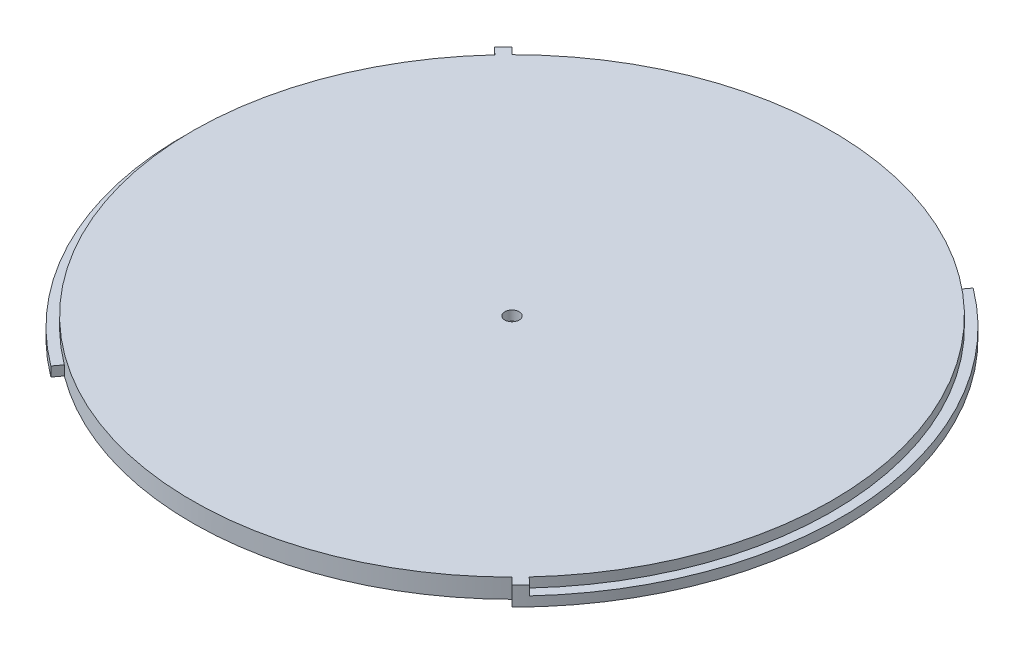
ISO-10303-21;
HEADER;
FILE_DESCRIPTION(('STEP AP214'),'2;1');
FILE_NAME('part.step','',(''),(''),'','','');
FILE_SCHEMA(('AUTOMOTIVE_DESIGN { 1 0 10303 214 1 1 1 1 }'));
ENDSEC;
DATA;
#1=APPLICATION_CONTEXT('core data for automotive mechanical design processes');
#2=APPLICATION_PROTOCOL_DEFINITION('international standard','automotive_design',2000,#1);
#3=PRODUCT_CONTEXT('',#1,'mechanical');
#4=PRODUCT('Part','Part','',(#3));
#5=PRODUCT_RELATED_PRODUCT_CATEGORY('part','',(#4));
#6=PRODUCT_DEFINITION_FORMATION('','',#4);
#7=PRODUCT_DEFINITION_CONTEXT('part definition',#1,'design');
#8=PRODUCT_DEFINITION('design','',#6,#7);
#9=PRODUCT_DEFINITION_SHAPE('','',#8);
#10=(LENGTH_UNIT() NAMED_UNIT(*) SI_UNIT(.MILLI.,.METRE.));
#11=(NAMED_UNIT(*) PLANE_ANGLE_UNIT() SI_UNIT($,.RADIAN.));
#12=(NAMED_UNIT(*) SI_UNIT($,.STERADIAN.) SOLID_ANGLE_UNIT());
#13=UNCERTAINTY_MEASURE_WITH_UNIT(LENGTH_MEASURE(1.E-05),#10,'distance_accuracy_value','');
#14=(GEOMETRIC_REPRESENTATION_CONTEXT(3) GLOBAL_UNCERTAINTY_ASSIGNED_CONTEXT((#13)) GLOBAL_UNIT_ASSIGNED_CONTEXT((#10,
#11,#12)) REPRESENTATION_CONTEXT('',''));
#15=CARTESIAN_POINT('',(0.,0.,0.));
#16=DIRECTION('',(0.,0.,1.));
#17=DIRECTION('',(1.,0.,0.));
#18=AXIS2_PLACEMENT_3D('',#15,#16,#17);
#19=CARTESIAN_POINT('',(-66.53,-2.00000000000001,0.));
#20=DIRECTION('',(0.,1.,0.));
#21=DIRECTION('',(-1.,0.,0.));
#22=AXIS2_PLACEMENT_3D('',#19,#20,#21);
#23=PLANE('',#22);
#24=CARTESIAN_POINT('',(0.,-2.,0.));
#25=DIRECTION('',(0.,1.,0.));
#26=DIRECTION('',(-1.,0.,0.));
#27=AXIS2_PLACEMENT_3D('',#24,#25,#26);
#28=CIRCLE('',#27,68.53);
#29=CARTESIAN_POINT('',(50.259047868636,-1.99999999999999,46.5874340068022));
#30=VERTEX_POINT('',#29);
#31=CARTESIAN_POINT('',(40.9241392063636,-2.,-54.9688614600865));
#32=VERTEX_POINT('',#31);
#33=EDGE_CURVE('E160',#30,#32,#28,.T.);
#34=ORIENTED_EDGE('',*,*,#33,.T.);
#35=DIRECTION('',(-0.597171154331879,0.,0.802113840071303));
#36=VECTOR('',#35,1.);
#37=CARTESIAN_POINT('',(-23.7254886747707,-2.,31.8678199548669));
#38=LINE('',#37,#36);
#39=CARTESIAN_POINT('',(39.7297968976998,-2.,-53.3646337799439));
#40=VERTEX_POINT('',#39);
#41=EDGE_CURVE('E153',#32,#40,#38,.T.);
#42=ORIENTED_EDGE('',*,*,#41,.T.);
#43=CARTESIAN_POINT('',(0.,-2.,0.));
#44=DIRECTION('',(0.,1.,0.));
#45=DIRECTION('',(-1.,0.,0.));
#46=AXIS2_PLACEMENT_3D('',#43,#44,#45);
#47=CIRCLE('',#46,66.53);
#48=CARTESIAN_POINT('',(48.7922727958608,-1.99999999999999,45.2278124102228));
#49=VERTEX_POINT('',#48);
#50=EDGE_CURVE('E203',#49,#40,#47,.T.);
#51=ORIENTED_EDGE('',*,*,#50,.F.);
#52=DIRECTION('',(-0.733387536387591,0.,-0.679810798289744));
#53=VECTOR('',#52,1.);
#54=CARTESIAN_POINT('',(48.7922727958609,-1.99999999999999,45.2278124102228));
#55=LINE('',#54,#53);
#56=EDGE_CURVE('E55',#30,#49,#55,.T.);
#57=ORIENTED_EDGE('',*,*,#56,.F.);
#58=EDGE_LOOP('',(#34,#42,#51,#57));
#59=FACE_BOUND('',#58,.T.);
#60=ADVANCED_FACE('F40',(#59),#23,.T.);
#61=CARTESIAN_POINT('',(0.,0.,0.));
#62=DIRECTION('',(0.,1.,0.));
#63=DIRECTION('',(-1.,0.,0.));
#64=AXIS2_PLACEMENT_3D('',#61,#62,#63);
#65=CYLINDRICAL_SURFACE('',#64,68.53);
#66=CARTESIAN_POINT('',(0.,-4.,0.));
#67=DIRECTION('',(0.,1.,0.));
#68=DIRECTION('',(-1.,0.,0.));
#69=AXIS2_PLACEMENT_3D('',#66,#67,#68);
#70=CIRCLE('',#69,68.53);
#71=CARTESIAN_POINT('',(48.4580277147147,-4.00000000000001,48.4580277146921));
#72=VERTEX_POINT('',#71);
#73=CARTESIAN_POINT('',(40.9241392063636,-4.,-54.9688614600865));
#74=VERTEX_POINT('',#73);
#75=EDGE_CURVE('E159',#72,#74,#70,.T.);
#76=ORIENTED_EDGE('',*,*,#75,.T.);
#77=DIRECTION('',(0.,1.,0.));
#78=VECTOR('',#77,1.);
#79=CARTESIAN_POINT('',(40.9241392063636,-9.99999999999999,-54.9688614600865));
#80=LINE('',#79,#78);
#81=EDGE_CURVE('E263',#74,#32,#80,.T.);
#82=ORIENTED_EDGE('',*,*,#81,.T.);
#83=ORIENTED_EDGE('',*,*,#33,.F.);
#84=DIRECTION('',(0.,1.,0.));
#85=VECTOR('',#84,1.);
#86=CARTESIAN_POINT('',(50.259047868636,-6.55763302205952,46.5874340068022));
#87=LINE('',#86,#85);
#88=CARTESIAN_POINT('',(50.259047868636,0.,46.5874340068022));
#89=VERTEX_POINT('',#88);
#90=EDGE_CURVE('E254',#30,#89,#87,.T.);
#91=ORIENTED_EDGE('',*,*,#90,.T.);
#92=CARTESIAN_POINT('',(0.,0.,0.));
#93=DIRECTION('',(0.,1.,0.));
#94=DIRECTION('',(-1.,0.,0.));
#95=AXIS2_PLACEMENT_3D('',#92,#93,#94);
#96=CIRCLE('',#95,68.53);
#97=CARTESIAN_POINT('',(48.4580277147254,0.,48.4580277147028));
#98=VERTEX_POINT('',#97);
#99=EDGE_CURVE('E248',#98,#89,#96,.T.);
#100=ORIENTED_EDGE('',*,*,#99,.F.);
#101=DIRECTION('',(0.,1.,0.));
#102=VECTOR('',#101,1.);
#103=CARTESIAN_POINT('',(48.4580277147147,-9.99999999999999,48.4580277146921));
#104=LINE('',#103,#102);
#105=EDGE_CURVE('E227',#72,#98,#104,.T.);
#106=ORIENTED_EDGE('',*,*,#105,.F.);
#107=EDGE_LOOP('',(#76,#82,#83,#91,#100,#106));
#108=FACE_BOUND('',#107,.T.);
#109=ADVANCED_FACE('F178',(#108),#65,.T.);
#110=CARTESIAN_POINT('',(-66.53,-4.00000000000001,0.));
#111=DIRECTION('',(0.,-1.,0.));
#112=DIRECTION('',(1.,0.,0.));
#113=AXIS2_PLACEMENT_3D('',#110,#111,#112);
#114=PLANE('',#113);
#115=DIRECTION('',(0.597171154331878,0.,-0.802113840071304));
#116=VECTOR('',#115,1.);
#117=CARTESIAN_POINT('',(-23.7254886747704,-4.,31.867819954867));
#118=LINE('',#117,#116);
#119=CARTESIAN_POINT('',(-40.9241392063636,-4.00000000000001,54.9688614600865));
#120=VERTEX_POINT('',#119);
#121=CARTESIAN_POINT('',(-39.7297968976998,-3.99999999999999,53.3646337799438));
#122=VERTEX_POINT('',#121);
#123=EDGE_CURVE('E134',#120,#122,#118,.T.);
#124=ORIENTED_EDGE('',*,*,#123,.F.);
#125=CARTESIAN_POINT('',(-48.4580277147143,-4.00000000000001,-48.4580277147139));
#126=VERTEX_POINT('',#125);
#127=EDGE_CURVE('E150',#126,#120,#70,.T.);
#128=ORIENTED_EDGE('',*,*,#127,.F.);
#129=DIRECTION('',(0.707106781186544,0.,0.707106781186551));
#130=VECTOR('',#129,1.);
#131=CARTESIAN_POINT('',(-33.2650000000002,-4.,-33.2649999999995));
#132=LINE('',#131,#130);
#133=CARTESIAN_POINT('',(-47.0438141523413,-4.00000000000001,-47.0438141523408));
#134=VERTEX_POINT('',#133);
#135=EDGE_CURVE('E219',#126,#134,#132,.T.);
#136=ORIENTED_EDGE('',*,*,#135,.T.);
#137=CARTESIAN_POINT('',(0.,-4.,0.));
#138=DIRECTION('',(0.,-1.,0.));
#139=DIRECTION('',(1.,0.,0.));
#140=AXIS2_PLACEMENT_3D('',#137,#138,#139);
#141=CIRCLE('',#140,66.53);
#142=CARTESIAN_POINT('',(39.7297968976998,-3.99999999999999,-53.3646337799439));
#143=VERTEX_POINT('',#142);
#144=EDGE_CURVE('E217',#134,#143,#141,.T.);
#145=ORIENTED_EDGE('',*,*,#144,.T.);
#146=DIRECTION('',(0.597171154331879,0.,-0.802113840071303));
#147=VECTOR('',#146,1.);
#148=CARTESIAN_POINT('',(-23.7254886747707,-4.,31.8678199548669));
#149=LINE('',#148,#147);
#150=EDGE_CURVE('E259',#143,#74,#149,.T.);
#151=ORIENTED_EDGE('',*,*,#150,.T.);
#152=ORIENTED_EDGE('',*,*,#75,.F.);
#153=DIRECTION('',(-0.707106781186712,0.,-0.707106781186383));
#154=VECTOR('',#153,1.);
#155=CARTESIAN_POINT('',(-33.2650000000155,-4.,-33.265));
#156=LINE('',#155,#154);
#157=CARTESIAN_POINT('',(47.043814152352,-3.99999999999999,47.0438141523301));
#158=VERTEX_POINT('',#157);
#159=EDGE_CURVE('E215',#72,#158,#156,.T.);
#160=ORIENTED_EDGE('',*,*,#159,.T.);
#161=CARTESIAN_POINT('',(0.,-4.,0.));
#162=DIRECTION('',(0.,-1.,0.));
#163=DIRECTION('',(1.,0.,0.));
#164=AXIS2_PLACEMENT_3D('',#161,#162,#163);
#165=CIRCLE('',#164,66.53);
#166=EDGE_CURVE('E152',#158,#122,#165,.T.);
#167=ORIENTED_EDGE('',*,*,#166,.T.);
#168=EDGE_LOOP('',(#124,#128,#136,#145,#151,#152,#160,#167));
#169=FACE_BOUND('',#168,.T.);
#170=CARTESIAN_POINT('',(0.,-4.,0.));
#171=DIRECTION('',(0.,1.,0.));
#172=DIRECTION('',(-1.,0.,0.));
#173=AXIS2_PLACEMENT_3D('',#170,#171,#172);
#174=CIRCLE('',#173,64.53);
#175=CARTESIAN_POINT('',(-64.53,-4.00000000000001,0.));
#176=VERTEX_POINT('',#175);
#177=EDGE_CURVE('E48',#176,#176,#174,.T.);
#178=ORIENTED_EDGE('',*,*,#177,.T.);
#179=EDGE_LOOP('',(#178));
#180=FACE_BOUND('',#179,.T.);
#181=ADVANCED_FACE('F147',(#169,#180),#114,.T.);
#182=CARTESIAN_POINT('',(0.,0.,0.));
#183=DIRECTION('',(0.,1.,0.));
#184=DIRECTION('',(-1.,0.,0.));
#185=AXIS2_PLACEMENT_3D('',#182,#183,#184);
#186=CYLINDRICAL_SURFACE('',#185,66.53);
#187=ORIENTED_EDGE('',*,*,#50,.T.);
#188=DIRECTION('',(0.,1.,0.));
#189=VECTOR('',#188,1.);
#190=CARTESIAN_POINT('',(39.7297968976998,-9.99999999999999,-53.3646337799439));
#191=LINE('',#190,#189);
#192=EDGE_CURVE('E143',#143,#40,#191,.T.);
#193=ORIENTED_EDGE('',*,*,#192,.F.);
#194=ORIENTED_EDGE('',*,*,#144,.F.);
#195=DIRECTION('',(0.,1.,0.));
#196=VECTOR('',#195,1.);
#197=CARTESIAN_POINT('',(-47.0438141523413,-10.,-47.0438141523408));
#198=LINE('',#197,#196);
#199=CARTESIAN_POINT('',(-47.0438141523411,0.,-47.0438141523409));
#200=VERTEX_POINT('',#199);
#201=EDGE_CURVE('E222',#134,#200,#198,.T.);
#202=ORIENTED_EDGE('',*,*,#201,.T.);
#203=CARTESIAN_POINT('',(0.,0.,0.));
#204=DIRECTION('',(0.,1.,0.));
#205=DIRECTION('',(-1.,0.,0.));
#206=AXIS2_PLACEMENT_3D('',#203,#204,#205);
#207=CIRCLE('',#206,66.53);
#208=CARTESIAN_POINT('',(48.7922727958664,0.,45.2278124102167));
#209=VERTEX_POINT('',#208);
#210=EDGE_CURVE('E205',#209,#200,#207,.T.);
#211=ORIENTED_EDGE('',*,*,#210,.F.);
#212=DIRECTION('',(0.,1.,0.));
#213=VECTOR('',#212,1.);
#214=CARTESIAN_POINT('',(48.7922727958608,-6.55763302205952,45.2278124102228));
#215=LINE('',#214,#213);
#216=EDGE_CURVE('E63',#49,#209,#215,.T.);
#217=ORIENTED_EDGE('',*,*,#216,.F.);
#218=EDGE_LOOP('',(#187,#193,#194,#202,#211,#217));
#219=FACE_BOUND('',#218,.T.);
#220=ADVANCED_FACE('F190',(#219),#186,.T.);
#221=DIRECTION('',(-0.597171154331878,0.,0.802113840071304));
#222=VECTOR('',#221,1.);
#223=CARTESIAN_POINT('',(-23.7254886747704,-2.,31.867819954867));
#224=LINE('',#223,#222);
#225=CARTESIAN_POINT('',(-39.7297968976998,-2.00000000000001,53.3646337799438));
#226=VERTEX_POINT('',#225);
#227=CARTESIAN_POINT('',(-40.9241392063636,-2.00000000000001,54.9688614600865));
#228=VERTEX_POINT('',#227);
#229=EDGE_CURVE('E137',#226,#228,#224,.T.);
#230=ORIENTED_EDGE('',*,*,#229,.F.);
#231=CARTESIAN_POINT('',(-48.7922727958609,-2.00000000000001,-45.2278124102227));
#232=VERTEX_POINT('',#231);
#233=EDGE_CURVE('E197',#232,#226,#47,.T.);
#234=ORIENTED_EDGE('',*,*,#233,.F.);
#235=DIRECTION('',(0.733387536387508,0.,0.679810798289834));
#236=VECTOR('',#235,1.);
#237=CARTESIAN_POINT('',(0.,-2.,0.));
#238=LINE('',#237,#236);
#239=CARTESIAN_POINT('',(-50.259047868636,-2.00000000000001,-46.5874340068023));
#240=VERTEX_POINT('',#239);
#241=EDGE_CURVE('E225',#240,#232,#238,.T.);
#242=ORIENTED_EDGE('',*,*,#241,.F.);
#243=EDGE_CURVE('E163',#240,#228,#28,.T.);
#244=ORIENTED_EDGE('',*,*,#243,.T.);
#245=EDGE_LOOP('',(#230,#234,#242,#244));
#246=FACE_BOUND('',#245,.T.);
#247=ADVANCED_FACE('F179',(#246),#23,.T.);
#248=CARTESIAN_POINT('',(0.,-2.,0.));
#249=DIRECTION('',(0.,-1.,0.));
#250=DIRECTION('',(1.,0.,0.));
#251=AXIS2_PLACEMENT_3D('',#248,#249,#250);
#252=PLANE('',#251);
#253=CARTESIAN_POINT('',(0.,-2.,0.));
#254=DIRECTION('',(0.,-1.,0.));
#255=DIRECTION('',(0.,0.,-1.));
#256=AXIS2_PLACEMENT_3D('',#253,#254,#255);
#257=CIRCLE('',#256,1.5);
#258=CARTESIAN_POINT('',(0.,-2.,-1.5));
#259=VERTEX_POINT('',#258);
#260=EDGE_CURVE('E211',#259,#259,#257,.T.);
#261=ORIENTED_EDGE('',*,*,#260,.F.);
#262=EDGE_LOOP('',(#261));
#263=FACE_BOUND('',#262,.T.);
#264=CARTESIAN_POINT('',(0.,-2.,0.));
#265=DIRECTION('',(0.,1.,0.));
#266=DIRECTION('',(-1.,0.,0.));
#267=AXIS2_PLACEMENT_3D('',#264,#265,#266);
#268=CIRCLE('',#267,64.53);
#269=CARTESIAN_POINT('',(-64.53,-2.00000000000001,0.));
#270=VERTEX_POINT('',#269);
#271=EDGE_CURVE('E12',#270,#270,#268,.T.);
#272=ORIENTED_EDGE('',*,*,#271,.F.);
#273=EDGE_LOOP('',(#272));
#274=FACE_BOUND('',#273,.T.);
#275=ADVANCED_FACE('F42',(#263,#274),#252,.T.);
#276=CARTESIAN_POINT('',(0.,0.,0.));
#277=DIRECTION('',(0.,1.,0.));
#278=DIRECTION('',(-1.,0.,0.));
#279=AXIS2_PLACEMENT_3D('',#276,#277,#278);
#280=CYLINDRICAL_SURFACE('',#279,64.53);
#281=ORIENTED_EDGE('',*,*,#271,.T.);
#282=EDGE_LOOP('',(#281));
#283=FACE_BOUND('',#282,.T.);
#284=ORIENTED_EDGE('',*,*,#177,.F.);
#285=EDGE_LOOP('',(#284));
#286=FACE_BOUND('',#285,.T.);
#287=ADVANCED_FACE('F169',(#283,#286),#280,.F.);
#288=DIRECTION('',(0.,1.,0.));
#289=VECTOR('',#288,1.);
#290=CARTESIAN_POINT('',(-40.9241392063636,-10.,54.9688614600865));
#291=LINE('',#290,#289);
#292=EDGE_CURVE('E131',#120,#228,#291,.T.);
#293=ORIENTED_EDGE('',*,*,#292,.T.);
#294=ORIENTED_EDGE('',*,*,#243,.F.);
#295=DIRECTION('',(0.,1.,0.));
#296=VECTOR('',#295,1.);
#297=CARTESIAN_POINT('',(-50.2590478686358,-6.55763302205953,-46.5874340068022));
#298=LINE('',#297,#296);
#299=CARTESIAN_POINT('',(-50.2590478686358,0.,-46.5874340068022));
#300=VERTEX_POINT('',#299);
#301=EDGE_CURVE('E231',#240,#300,#298,.T.);
#302=ORIENTED_EDGE('',*,*,#301,.T.);
#303=CARTESIAN_POINT('',(0.,0.,0.));
#304=DIRECTION('',(0.,1.,0.));
#305=DIRECTION('',(-1.,0.,0.));
#306=AXIS2_PLACEMENT_3D('',#303,#304,#305);
#307=CIRCLE('',#306,68.53);
#308=CARTESIAN_POINT('',(-48.4580277147141,0.,-48.4580277147139));
#309=VERTEX_POINT('',#308);
#310=EDGE_CURVE('E237',#309,#300,#307,.T.);
#311=ORIENTED_EDGE('',*,*,#310,.F.);
#312=DIRECTION('',(0.,1.,0.));
#313=VECTOR('',#312,1.);
#314=CARTESIAN_POINT('',(-48.4580277147143,-10.,-48.4580277147139));
#315=LINE('',#314,#313);
#316=EDGE_CURVE('E158',#126,#309,#315,.T.);
#317=ORIENTED_EDGE('',*,*,#316,.F.);
#318=ORIENTED_EDGE('',*,*,#127,.T.);
#319=EDGE_LOOP('',(#293,#294,#302,#311,#317,#318));
#320=FACE_BOUND('',#319,.T.);
#321=ADVANCED_FACE('F156',(#320),#65,.T.);
#322=ORIENTED_EDGE('',*,*,#233,.T.);
#323=DIRECTION('',(0.,1.,0.));
#324=VECTOR('',#323,1.);
#325=CARTESIAN_POINT('',(-39.7297968976998,-10.,53.3646337799438));
#326=LINE('',#325,#324);
#327=EDGE_CURVE('E142',#122,#226,#326,.T.);
#328=ORIENTED_EDGE('',*,*,#327,.F.);
#329=ORIENTED_EDGE('',*,*,#166,.F.);
#330=DIRECTION('',(0.,1.,0.));
#331=VECTOR('',#330,1.);
#332=CARTESIAN_POINT('',(47.043814152352,-9.99999999999999,47.0438141523301));
#333=LINE('',#332,#331);
#334=CARTESIAN_POINT('',(47.043814152352,0.,47.0438141523301));
#335=VERTEX_POINT('',#334);
#336=EDGE_CURVE('E221',#158,#335,#333,.T.);
#337=ORIENTED_EDGE('',*,*,#336,.T.);
#338=CARTESIAN_POINT('',(-48.7922727958609,0.,-45.2278124102227));
#339=VERTEX_POINT('',#338);
#340=EDGE_CURVE('E204',#339,#335,#207,.T.);
#341=ORIENTED_EDGE('',*,*,#340,.F.);
#342=DIRECTION('',(0.,1.,0.));
#343=VECTOR('',#342,1.);
#344=CARTESIAN_POINT('',(-48.7922727958609,-6.55763302205953,-45.2278124102227));
#345=LINE('',#344,#343);
#346=EDGE_CURVE('E202',#232,#339,#345,.T.);
#347=ORIENTED_EDGE('',*,*,#346,.F.);
#348=EDGE_LOOP('',(#322,#328,#329,#337,#341,#347));
#349=FACE_BOUND('',#348,.T.);
#350=ADVANCED_FACE('F176',(#349),#186,.T.);
#351=CARTESIAN_POINT('',(0.,0.,0.));
#352=DIRECTION('',(0.,1.,0.));
#353=DIRECTION('',(-1.,0.,0.));
#354=AXIS2_PLACEMENT_3D('',#351,#352,#353);
#355=PLANE('',#354);
#356=CARTESIAN_POINT('',(0.,0.,0.));
#357=DIRECTION('',(0.,1.,0.));
#358=DIRECTION('',(-1.,0.,0.));
#359=AXIS2_PLACEMENT_3D('',#356,#357,#358);
#360=CIRCLE('',#359,1.5);
#361=CARTESIAN_POINT('',(-1.5,0.,0.));
#362=VERTEX_POINT('',#361);
#363=EDGE_CURVE('E208',#362,#362,#360,.T.);
#364=ORIENTED_EDGE('',*,*,#363,.F.);
#365=EDGE_LOOP('',(#364));
#366=FACE_BOUND('',#365,.T.);
#367=ORIENTED_EDGE('',*,*,#340,.T.);
#368=DIRECTION('',(0.707106781186714,0.,0.707106781186381));
#369=VECTOR('',#368,1.);
#370=CARTESIAN_POINT('',(47.043814152352,0.,47.0438141523301));
#371=LINE('',#370,#369);
#372=EDGE_CURVE('E243',#335,#98,#371,.T.);
#373=ORIENTED_EDGE('',*,*,#372,.T.);
#374=ORIENTED_EDGE('',*,*,#99,.T.);
#375=DIRECTION('',(0.733387536387591,0.,0.679810798289744));
#376=VECTOR('',#375,1.);
#377=CARTESIAN_POINT('',(48.7922727958609,0.,45.2278124102228));
#378=LINE('',#377,#376);
#379=EDGE_CURVE('E251',#209,#89,#378,.T.);
#380=ORIENTED_EDGE('',*,*,#379,.F.);
#381=ORIENTED_EDGE('',*,*,#210,.T.);
#382=DIRECTION('',(-0.707106781186549,0.,-0.707106781186546));
#383=VECTOR('',#382,1.);
#384=CARTESIAN_POINT('',(0.,0.,0.));
#385=LINE('',#384,#383);
#386=EDGE_CURVE('E240',#200,#309,#385,.T.);
#387=ORIENTED_EDGE('',*,*,#386,.T.);
#388=ORIENTED_EDGE('',*,*,#310,.T.);
#389=DIRECTION('',(-0.733387536387508,0.,-0.679810798289834));
#390=VECTOR('',#389,1.);
#391=CARTESIAN_POINT('',(0.,0.,0.));
#392=LINE('',#391,#390);
#393=EDGE_CURVE('E233',#339,#300,#392,.T.);
#394=ORIENTED_EDGE('',*,*,#393,.F.);
#395=EDGE_LOOP('',(#367,#373,#374,#380,#381,#387,#388,#394));
#396=FACE_BOUND('',#395,.T.);
#397=ADVANCED_FACE('F281',(#366,#396),#355,.T.);
#398=CARTESIAN_POINT('',(0.,-2.,0.));
#399=DIRECTION('',(0.,-1.,0.));
#400=DIRECTION('',(0.,0.,-1.));
#401=AXIS2_PLACEMENT_3D('',#398,#399,#400);
#402=CYLINDRICAL_SURFACE('',#401,1.5);
#403=ORIENTED_EDGE('',*,*,#363,.T.);
#404=EDGE_LOOP('',(#403));
#405=FACE_BOUND('',#404,.T.);
#406=ORIENTED_EDGE('',*,*,#260,.T.);
#407=EDGE_LOOP('',(#406));
#408=FACE_BOUND('',#407,.T.);
#409=ADVANCED_FACE('F303',(#405,#408),#402,.F.);
#410=CARTESIAN_POINT('',(-47.0438141523413,-10.,-47.0438141523408));
#411=DIRECTION('',(0.707106781186551,0.,-0.707106781186544));
#412=DIRECTION('',(-0.707106781186544,0.,-0.707106781186551));
#413=AXIS2_PLACEMENT_3D('',#410,#411,#412);
#414=PLANE('',#413);
#415=ORIENTED_EDGE('',*,*,#316,.T.);
#416=ORIENTED_EDGE('',*,*,#386,.F.);
#417=ORIENTED_EDGE('',*,*,#201,.F.);
#418=ORIENTED_EDGE('',*,*,#135,.F.);
#419=EDGE_LOOP('',(#415,#416,#417,#418));
#420=FACE_BOUND('',#419,.T.);
#421=ADVANCED_FACE('F275',(#420),#414,.T.);
#422=CARTESIAN_POINT('',(0.,-10.,0.));
#423=DIRECTION('',(-0.707106781186383,0.,0.707106781186712));
#424=DIRECTION('',(0.707106781186712,0.,0.707106781186383));
#425=AXIS2_PLACEMENT_3D('',#422,#423,#424);
#426=PLANE('',#425);
#427=ORIENTED_EDGE('',*,*,#105,.T.);
#428=ORIENTED_EDGE('',*,*,#372,.F.);
#429=ORIENTED_EDGE('',*,*,#336,.F.);
#430=ORIENTED_EDGE('',*,*,#159,.F.);
#431=EDGE_LOOP('',(#427,#428,#429,#430));
#432=FACE_BOUND('',#431,.T.);
#433=ADVANCED_FACE('F285',(#432),#426,.T.);
#434=CARTESIAN_POINT('',(0.,-6.55763302205952,0.));
#435=DIRECTION('',(0.679810798289834,0.,-0.733387536387508));
#436=DIRECTION('',(-0.733387536387508,0.,-0.679810798289834));
#437=AXIS2_PLACEMENT_3D('',#434,#435,#436);
#438=PLANE('',#437);
#439=ORIENTED_EDGE('',*,*,#301,.F.);
#440=ORIENTED_EDGE('',*,*,#241,.T.);
#441=ORIENTED_EDGE('',*,*,#346,.T.);
#442=ORIENTED_EDGE('',*,*,#393,.T.);
#443=EDGE_LOOP('',(#439,#440,#441,#442));
#444=FACE_BOUND('',#443,.T.);
#445=ADVANCED_FACE('F290',(#444),#438,.F.);
#446=CARTESIAN_POINT('',(48.7922727958609,-6.55763302205952,45.2278124102228));
#447=DIRECTION('',(-0.679810798289744,0.,0.733387536387591));
#448=DIRECTION('',(0.733387536387591,0.,0.679810798289744));
#449=AXIS2_PLACEMENT_3D('',#446,#447,#448);
#450=PLANE('',#449);
#451=ORIENTED_EDGE('',*,*,#90,.F.);
#452=ORIENTED_EDGE('',*,*,#56,.T.);
#453=ORIENTED_EDGE('',*,*,#216,.T.);
#454=ORIENTED_EDGE('',*,*,#379,.T.);
#455=EDGE_LOOP('',(#451,#452,#453,#454));
#456=FACE_BOUND('',#455,.T.);
#457=ADVANCED_FACE('F280',(#456),#450,.F.);
#458=CARTESIAN_POINT('',(0.,-10.,0.));
#459=DIRECTION('',(-0.802113840071303,0.,-0.597171154331878));
#460=DIRECTION('',(-0.597171154331878,0.,0.802113840071304));
#461=AXIS2_PLACEMENT_3D('',#458,#459,#460);
#462=PLANE('',#461);
#463=ORIENTED_EDGE('',*,*,#229,.T.);
#464=ORIENTED_EDGE('',*,*,#292,.F.);
#465=ORIENTED_EDGE('',*,*,#123,.T.);
#466=ORIENTED_EDGE('',*,*,#327,.T.);
#467=EDGE_LOOP('',(#463,#464,#465,#466));
#468=FACE_BOUND('',#467,.T.);
#469=ADVANCED_FACE('F133',(#468),#462,.F.);
#470=CARTESIAN_POINT('',(40.9241392063635,-9.99999999999999,-54.9688614600865));
#471=DIRECTION('',(-0.802113840071303,0.,-0.597171154331879));
#472=DIRECTION('',(-0.597171154331879,0.,0.802113840071303));
#473=AXIS2_PLACEMENT_3D('',#470,#471,#472);
#474=PLANE('',#473);
#475=ORIENTED_EDGE('',*,*,#81,.F.);
#476=ORIENTED_EDGE('',*,*,#150,.F.);
#477=ORIENTED_EDGE('',*,*,#192,.T.);
#478=ORIENTED_EDGE('',*,*,#41,.F.);
#479=EDGE_LOOP('',(#475,#476,#477,#478));
#480=FACE_BOUND('',#479,.T.);
#481=ADVANCED_FACE('F273',(#480),#474,.T.);
#482=CLOSED_SHELL('',(#60,#109,#181,#220,#247,#275,#287,#321,#350,#397,#409,#421,#433,#445,#457,
#469,#481));
#483=MANIFOLD_SOLID_BREP('B2',#482);
#484=ADVANCED_BREP_SHAPE_REPRESENTATION('',(#18,#483),#14);
#485=SHAPE_DEFINITION_REPRESENTATION(#9,#484);
ENDSEC;
END-ISO-10303-21;
